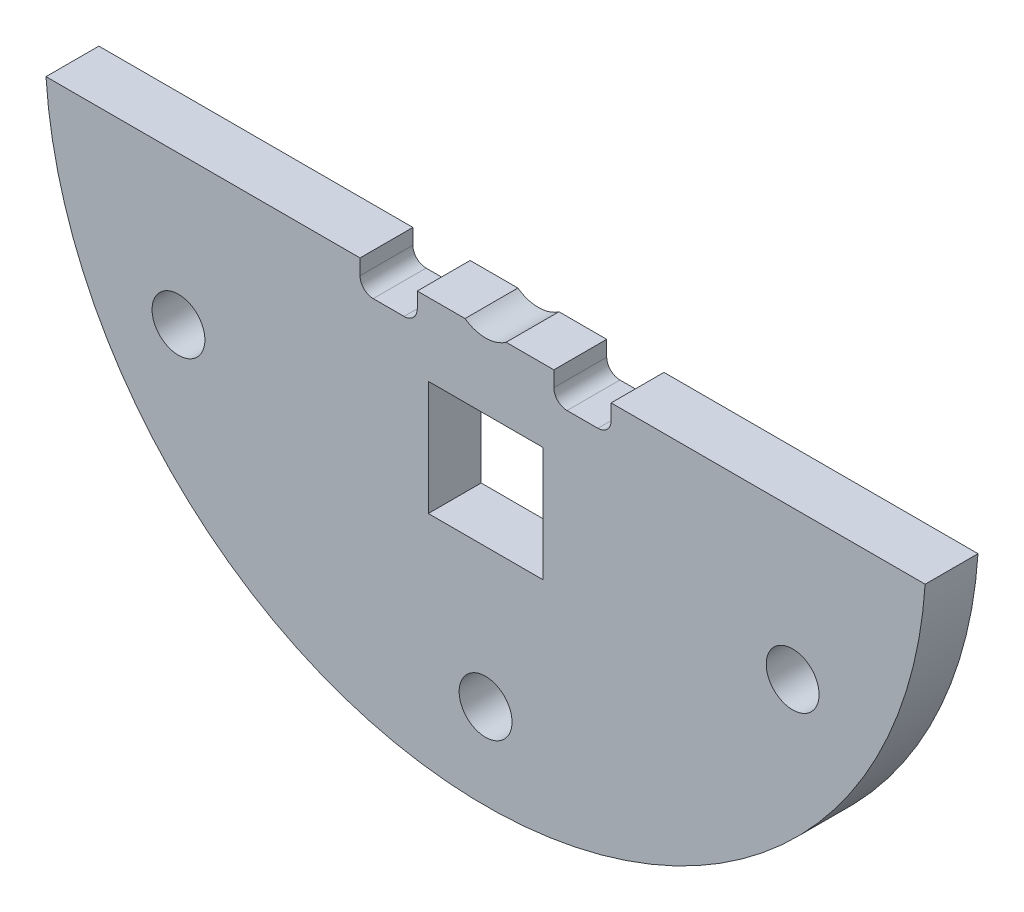
ISO-10303-21;
HEADER;
FILE_DESCRIPTION(('STEP AP214'),'2;1');
FILE_NAME('part.step','',(''),(''),'','','');
FILE_SCHEMA(('AUTOMOTIVE_DESIGN { 1 0 10303 214 1 1 1 1 }'));
ENDSEC;
DATA;
#1=APPLICATION_CONTEXT('core data for automotive mechanical design processes');
#2=APPLICATION_PROTOCOL_DEFINITION('international standard','automotive_design',2000,#1);
#3=PRODUCT_CONTEXT('',#1,'mechanical');
#4=PRODUCT('Part','Part','',(#3));
#5=PRODUCT_RELATED_PRODUCT_CATEGORY('part','',(#4));
#6=PRODUCT_DEFINITION_FORMATION('','',#4);
#7=PRODUCT_DEFINITION_CONTEXT('part definition',#1,'design');
#8=PRODUCT_DEFINITION('design','',#6,#7);
#9=PRODUCT_DEFINITION_SHAPE('','',#8);
#10=(LENGTH_UNIT() NAMED_UNIT(*) SI_UNIT(.MILLI.,.METRE.));
#11=(NAMED_UNIT(*) PLANE_ANGLE_UNIT() SI_UNIT($,.RADIAN.));
#12=(NAMED_UNIT(*) SI_UNIT($,.STERADIAN.) SOLID_ANGLE_UNIT());
#13=UNCERTAINTY_MEASURE_WITH_UNIT(LENGTH_MEASURE(1.E-05),#10,'distance_accuracy_value','');
#14=(GEOMETRIC_REPRESENTATION_CONTEXT(3) GLOBAL_UNCERTAINTY_ASSIGNED_CONTEXT((#13)) GLOBAL_UNIT_ASSIGNED_CONTEXT((#10,
#11,#12)) REPRESENTATION_CONTEXT('',''));
#15=CARTESIAN_POINT('',(0.,0.,0.));
#16=DIRECTION('',(0.,0.,1.));
#17=DIRECTION('',(1.,0.,0.));
#18=AXIS2_PLACEMENT_3D('',#15,#16,#17);
#19=CARTESIAN_POINT('',(190.230949351342,190.589281636706,3.));
#20=DIRECTION('',(0.,0.,1.));
#21=DIRECTION('',(1.,0.,0.));
#22=AXIS2_PLACEMENT_3D('',#19,#20,#21);
#23=PLANE('',#22);
#24=CARTESIAN_POINT('',(207.6593744092,180.5269757379,3.));
#25=DIRECTION('',(0.,0.,1.));
#26=DIRECTION('',(1.,0.,0.));
#27=AXIS2_PLACEMENT_3D('',#24,#25,#26);
#28=CIRCLE('',#27,1.5);
#29=CARTESIAN_POINT('',(209.1593744092,180.5269757379,3.));
#30=VERTEX_POINT('',#29);
#31=EDGE_CURVE('E206',#30,#30,#28,.T.);
#32=ORIENTED_EDGE('',*,*,#31,.F.);
#33=EDGE_LOOP('',(#32));
#34=FACE_BOUND('',#33,.T.);
#35=CARTESIAN_POINT('',(172.8025242934,180.5269757379,3.));
#36=DIRECTION('',(0.,0.,1.));
#37=DIRECTION('',(1.,0.,0.));
#38=AXIS2_PLACEMENT_3D('',#35,#36,#37);
#39=CIRCLE('',#38,1.5);
#40=CARTESIAN_POINT('',(174.3025242934,180.5269757379,3.));
#41=VERTEX_POINT('',#40);
#42=EDGE_CURVE('E218',#41,#41,#39,.T.);
#43=ORIENTED_EDGE('',*,*,#42,.F.);
#44=EDGE_LOOP('',(#43));
#45=FACE_BOUND('',#44,.T.);
#46=CARTESIAN_POINT('',(190.230949351342,190.589281636706,3.));
#47=DIRECTION('',(0.,0.,1.));
#48=DIRECTION('',(1.,0.,0.));
#49=AXIS2_PLACEMENT_3D('',#46,#47,#48);
#50=CIRCLE('',#49,25.);
#51=CARTESIAN_POINT('',(165.2838177527,188.9642816367,3.));
#52=VERTEX_POINT('',#51);
#53=CARTESIAN_POINT('',(215.1780809499,188.9642816367,3.));
#54=VERTEX_POINT('',#53);
#55=EDGE_CURVE('E224',#52,#54,#50,.T.);
#56=ORIENTED_EDGE('',*,*,#55,.T.);
#57=DIRECTION('',(-1.,0.,0.));
#58=VECTOR('',#57,1.);
#59=CARTESIAN_POINT('',(197.3559493513,188.9642816367,3.));
#60=LINE('',#59,#58);
#61=CARTESIAN_POINT('',(197.3559493513,188.9642816367,3.));
#62=VERTEX_POINT('',#61);
#63=EDGE_CURVE('E226',#54,#62,#60,.T.);
#64=ORIENTED_EDGE('',*,*,#63,.T.);
#65=DIRECTION('',(0.,-1.,0.));
#66=VECTOR('',#65,1.);
#67=CARTESIAN_POINT('',(197.3559493513,188.0892816367,3.));
#68=LINE('',#67,#66);
#69=CARTESIAN_POINT('',(197.3559493513,188.0892816367,3.));
#70=VERTEX_POINT('',#69);
#71=EDGE_CURVE('E229',#62,#70,#68,.T.);
#72=ORIENTED_EDGE('',*,*,#71,.T.);
#73=CARTESIAN_POINT('',(196.6059493513,188.0892816367,3.));
#74=DIRECTION('',(0.,0.,-1.));
#75=DIRECTION('',(1.,0.,0.));
#76=AXIS2_PLACEMENT_3D('',#73,#74,#75);
#77=CIRCLE('',#76,0.750000000000237);
#78=CARTESIAN_POINT('',(196.6059493513,187.3392816367,3.));
#79=VERTEX_POINT('',#78);
#80=EDGE_CURVE('E231',#70,#79,#77,.T.);
#81=ORIENTED_EDGE('',*,*,#80,.T.);
#82=DIRECTION('',(-1.,0.,0.));
#83=VECTOR('',#82,1.);
#84=CARTESIAN_POINT('',(194.8559493513,187.3392816367,3.));
#85=LINE('',#84,#83);
#86=CARTESIAN_POINT('',(194.8559493513,187.3392816367,3.));
#87=VERTEX_POINT('',#86);
#88=EDGE_CURVE('E233',#79,#87,#85,.T.);
#89=ORIENTED_EDGE('',*,*,#88,.T.);
#90=CARTESIAN_POINT('',(194.8559493513,188.0892816367,3.));
#91=DIRECTION('',(0.,0.,-1.));
#92=DIRECTION('',(1.,0.,0.));
#93=AXIS2_PLACEMENT_3D('',#90,#91,#92);
#94=CIRCLE('',#93,0.750000000000001);
#95=CARTESIAN_POINT('',(194.1059493513,188.0892816367,3.));
#96=VERTEX_POINT('',#95);
#97=EDGE_CURVE('E235',#87,#96,#94,.T.);
#98=ORIENTED_EDGE('',*,*,#97,.T.);
#99=DIRECTION('',(0.,1.,0.));
#100=VECTOR('',#99,1.);
#101=CARTESIAN_POINT('',(194.1059493513,188.9642816367,3.));
#102=LINE('',#101,#100);
#103=CARTESIAN_POINT('',(194.1059493513,188.9642816367,3.));
#104=VERTEX_POINT('',#103);
#105=EDGE_CURVE('E237',#96,#104,#102,.T.);
#106=ORIENTED_EDGE('',*,*,#105,.T.);
#107=DIRECTION('',(-1.,-2.97116512054396E-13,0.));
#108=VECTOR('',#107,1.);
#109=CARTESIAN_POINT('',(191.396871732935,188.964281636699,3.));
#110=LINE('',#109,#108);
#111=CARTESIAN_POINT('',(191.396871732949,188.964281636679,3.));
#112=VERTEX_POINT('',#111);
#113=EDGE_CURVE('E239',#104,#112,#110,.T.);
#114=ORIENTED_EDGE('',*,*,#113,.T.);
#115=CARTESIAN_POINT('',(190.230949351342,190.589281636706,3.));
#116=DIRECTION('',(0.,0.,-1.));
#117=DIRECTION('',(1.,0.,0.));
#118=AXIS2_PLACEMENT_3D('',#115,#116,#117);
#119=CIRCLE('',#118,2.00000000000458);
#120=CARTESIAN_POINT('',(189.065026969665,188.964281636699,3.));
#121=VERTEX_POINT('',#120);
#122=EDGE_CURVE('E241',#112,#121,#119,.T.);
#123=ORIENTED_EDGE('',*,*,#122,.T.);
#124=DIRECTION('',(-1.,2.97116512054396E-13,0.));
#125=VECTOR('',#124,1.);
#126=CARTESIAN_POINT('',(186.3559493513,188.9642816367,3.));
#127=LINE('',#126,#125);
#128=CARTESIAN_POINT('',(186.3559493513,188.9642816367,3.));
#129=VERTEX_POINT('',#128);
#130=EDGE_CURVE('E243',#121,#129,#127,.T.);
#131=ORIENTED_EDGE('',*,*,#130,.T.);
#132=DIRECTION('',(0.,-1.,0.));
#133=VECTOR('',#132,1.);
#134=CARTESIAN_POINT('',(186.3559493513,188.9642816367,3.));
#135=LINE('',#134,#133);
#136=CARTESIAN_POINT('',(186.3559493513,188.0892816367,3.));
#137=VERTEX_POINT('',#136);
#138=EDGE_CURVE('E245',#129,#137,#135,.T.);
#139=ORIENTED_EDGE('',*,*,#138,.T.);
#140=CARTESIAN_POINT('',(185.6059493513,188.0892816367,3.));
#141=DIRECTION('',(0.,0.,-1.));
#142=DIRECTION('',(1.,0.,0.));
#143=AXIS2_PLACEMENT_3D('',#140,#141,#142);
#144=CIRCLE('',#143,0.750000000000001);
#145=CARTESIAN_POINT('',(185.6059493513,187.3392816367,3.));
#146=VERTEX_POINT('',#145);
#147=EDGE_CURVE('E247',#137,#146,#144,.T.);
#148=ORIENTED_EDGE('',*,*,#147,.T.);
#149=DIRECTION('',(-1.,0.,0.));
#150=VECTOR('',#149,1.);
#151=CARTESIAN_POINT('',(185.6059493513,187.3392816367,3.));
#152=LINE('',#151,#150);
#153=CARTESIAN_POINT('',(183.8559493513,187.3392816367,3.));
#154=VERTEX_POINT('',#153);
#155=EDGE_CURVE('E249',#146,#154,#152,.T.);
#156=ORIENTED_EDGE('',*,*,#155,.T.);
#157=CARTESIAN_POINT('',(183.8559493513,188.0892816367,3.));
#158=DIRECTION('',(0.,0.,-1.));
#159=DIRECTION('',(1.,0.,0.));
#160=AXIS2_PLACEMENT_3D('',#157,#158,#159);
#161=CIRCLE('',#160,0.750000000000001);
#162=CARTESIAN_POINT('',(183.1059493513,188.0892816367,3.));
#163=VERTEX_POINT('',#162);
#164=EDGE_CURVE('E251',#154,#163,#161,.T.);
#165=ORIENTED_EDGE('',*,*,#164,.T.);
#166=DIRECTION('',(0.,1.,0.));
#167=VECTOR('',#166,1.);
#168=CARTESIAN_POINT('',(183.1059493513,188.0892816367,3.));
#169=LINE('',#168,#167);
#170=CARTESIAN_POINT('',(183.1059493513,188.9642816367,3.));
#171=VERTEX_POINT('',#170);
#172=EDGE_CURVE('E253',#163,#171,#169,.T.);
#173=ORIENTED_EDGE('',*,*,#172,.T.);
#174=DIRECTION('',(-1.,0.,0.));
#175=VECTOR('',#174,1.);
#176=CARTESIAN_POINT('',(165.2838177527,188.9642816367,3.));
#177=LINE('',#176,#175);
#178=EDGE_CURVE('E255',#171,#52,#177,.T.);
#179=ORIENTED_EDGE('',*,*,#178,.T.);
#180=EDGE_LOOP('',(#56,#64,#72,#81,#89,#98,#106,#114,#123,#131,#139,#148,#156,#165,#173,#179));
#181=FACE_BOUND('',#180,.T.);
#182=CARTESIAN_POINT('',(190.2309493513,170.4646698392,3.));
#183=DIRECTION('',(0.,0.,1.));
#184=DIRECTION('',(1.,0.,0.));
#185=AXIS2_PLACEMENT_3D('',#182,#183,#184);
#186=CIRCLE('',#185,1.5);
#187=CARTESIAN_POINT('',(191.7309493513,170.4646698392,3.));
#188=VERTEX_POINT('',#187);
#189=EDGE_CURVE('E212',#188,#188,#186,.T.);
#190=ORIENTED_EDGE('',*,*,#189,.F.);
#191=EDGE_LOOP('',(#190));
#192=FACE_BOUND('',#191,.T.);
#193=DIRECTION('',(-1.,0.,0.));
#194=VECTOR('',#193,1.);
#195=CARTESIAN_POINT('',(193.4809493513,184.8392816367,3.));
#196=LINE('',#195,#194);
#197=CARTESIAN_POINT('',(193.4809493513,184.8392816367,3.));
#198=VERTEX_POINT('',#197);
#199=CARTESIAN_POINT('',(186.9809493513,184.8392816367,3.));
#200=VERTEX_POINT('',#199);
#201=EDGE_CURVE('E178',#198,#200,#196,.T.);
#202=ORIENTED_EDGE('',*,*,#201,.F.);
#203=DIRECTION('',(0.,1.,0.));
#204=VECTOR('',#203,1.);
#205=CARTESIAN_POINT('',(193.4809493513,178.3392816367,3.));
#206=LINE('',#205,#204);
#207=CARTESIAN_POINT('',(193.4809493513,178.3392816367,3.));
#208=VERTEX_POINT('',#207);
#209=EDGE_CURVE('E170',#208,#198,#206,.T.);
#210=ORIENTED_EDGE('',*,*,#209,.F.);
#211=DIRECTION('',(1.,0.,0.));
#212=VECTOR('',#211,1.);
#213=CARTESIAN_POINT('',(186.9809493513,178.3392816367,3.));
#214=LINE('',#213,#212);
#215=CARTESIAN_POINT('',(186.9809493513,178.3392816367,3.));
#216=VERTEX_POINT('',#215);
#217=EDGE_CURVE('E192',#216,#208,#214,.T.);
#218=ORIENTED_EDGE('',*,*,#217,.F.);
#219=DIRECTION('',(0.,-1.,0.));
#220=VECTOR('',#219,1.);
#221=CARTESIAN_POINT('',(186.9809493513,184.8392816367,3.));
#222=LINE('',#221,#220);
#223=EDGE_CURVE('E190',#200,#216,#222,.T.);
#224=ORIENTED_EDGE('',*,*,#223,.F.);
#225=EDGE_LOOP('',(#202,#210,#218,#224));
#226=FACE_BOUND('',#225,.T.);
#227=ADVANCED_FACE('F33',(#34,#45,#181,#192,#226),#23,.T.);
#228=CARTESIAN_POINT('',(190.230949351342,190.589281636706,0.));
#229=DIRECTION('',(0.,0.,1.));
#230=DIRECTION('',(1.,0.,0.));
#231=AXIS2_PLACEMENT_3D('',#228,#229,#230);
#232=PLANE('',#231);
#233=CARTESIAN_POINT('',(207.6593744092,180.5269757379,0.));
#234=DIRECTION('',(0.,0.,1.));
#235=DIRECTION('',(1.,0.,0.));
#236=AXIS2_PLACEMENT_3D('',#233,#234,#235);
#237=CIRCLE('',#236,1.5);
#238=CARTESIAN_POINT('',(209.1593744092,180.5269757379,0.));
#239=VERTEX_POINT('',#238);
#240=EDGE_CURVE('E186',#239,#239,#237,.T.);
#241=ORIENTED_EDGE('',*,*,#240,.T.);
#242=EDGE_LOOP('',(#241));
#243=FACE_BOUND('',#242,.T.);
#244=CARTESIAN_POINT('',(172.8025242934,180.5269757379,0.));
#245=DIRECTION('',(0.,0.,1.));
#246=DIRECTION('',(1.,0.,0.));
#247=AXIS2_PLACEMENT_3D('',#244,#245,#246);
#248=CIRCLE('',#247,1.5);
#249=CARTESIAN_POINT('',(174.3025242934,180.5269757379,0.));
#250=VERTEX_POINT('',#249);
#251=EDGE_CURVE('E215',#250,#250,#248,.T.);
#252=ORIENTED_EDGE('',*,*,#251,.T.);
#253=EDGE_LOOP('',(#252));
#254=FACE_BOUND('',#253,.T.);
#255=CARTESIAN_POINT('',(190.230949351342,190.589281636706,0.));
#256=DIRECTION('',(0.,0.,1.));
#257=DIRECTION('',(1.,0.,0.));
#258=AXIS2_PLACEMENT_3D('',#255,#256,#257);
#259=CIRCLE('',#258,24.9999999999577);
#260=CARTESIAN_POINT('',(165.2838177527,188.9642816367,0.));
#261=VERTEX_POINT('',#260);
#262=CARTESIAN_POINT('',(215.1780809499,188.9642816367,0.));
#263=VERTEX_POINT('',#262);
#264=EDGE_CURVE('E221',#261,#263,#259,.T.);
#265=ORIENTED_EDGE('',*,*,#264,.F.);
#266=DIRECTION('',(-1.,0.,0.));
#267=VECTOR('',#266,1.);
#268=CARTESIAN_POINT('',(165.2838177527,188.9642816367,0.));
#269=LINE('',#268,#267);
#270=CARTESIAN_POINT('',(183.1059493513,188.9642816367,0.));
#271=VERTEX_POINT('',#270);
#272=EDGE_CURVE('E227',#271,#261,#269,.T.);
#273=ORIENTED_EDGE('',*,*,#272,.F.);
#274=DIRECTION('',(0.,1.,0.));
#275=VECTOR('',#274,1.);
#276=CARTESIAN_POINT('',(183.1059493513,188.0892816367,0.));
#277=LINE('',#276,#275);
#278=CARTESIAN_POINT('',(183.1059493513,188.0892816367,0.));
#279=VERTEX_POINT('',#278);
#280=EDGE_CURVE('E285',#279,#271,#277,.T.);
#281=ORIENTED_EDGE('',*,*,#280,.F.);
#282=CARTESIAN_POINT('',(183.8559493513,188.0892816367,0.));
#283=DIRECTION('',(0.,0.,-1.));
#284=DIRECTION('',(1.,0.,0.));
#285=AXIS2_PLACEMENT_3D('',#282,#283,#284);
#286=CIRCLE('',#285,0.750000000000001);
#287=CARTESIAN_POINT('',(183.8559493513,187.3392816367,0.));
#288=VERTEX_POINT('',#287);
#289=EDGE_CURVE('E283',#288,#279,#286,.T.);
#290=ORIENTED_EDGE('',*,*,#289,.F.);
#291=DIRECTION('',(-1.,0.,0.));
#292=VECTOR('',#291,1.);
#293=CARTESIAN_POINT('',(185.6059493513,187.3392816367,0.));
#294=LINE('',#293,#292);
#295=CARTESIAN_POINT('',(185.6059493513,187.3392816367,0.));
#296=VERTEX_POINT('',#295);
#297=EDGE_CURVE('E281',#296,#288,#294,.T.);
#298=ORIENTED_EDGE('',*,*,#297,.F.);
#299=CARTESIAN_POINT('',(185.6059493513,188.0892816367,0.));
#300=DIRECTION('',(0.,0.,-1.));
#301=DIRECTION('',(1.,0.,0.));
#302=AXIS2_PLACEMENT_3D('',#299,#300,#301);
#303=CIRCLE('',#302,0.750000000000001);
#304=CARTESIAN_POINT('',(186.3559493513,188.0892816367,0.));
#305=VERTEX_POINT('',#304);
#306=EDGE_CURVE('E279',#305,#296,#303,.T.);
#307=ORIENTED_EDGE('',*,*,#306,.F.);
#308=DIRECTION('',(0.,-1.,0.));
#309=VECTOR('',#308,1.);
#310=CARTESIAN_POINT('',(186.3559493513,188.9642816367,0.));
#311=LINE('',#310,#309);
#312=CARTESIAN_POINT('',(186.3559493513,188.9642816367,0.));
#313=VERTEX_POINT('',#312);
#314=EDGE_CURVE('E277',#313,#305,#311,.T.);
#315=ORIENTED_EDGE('',*,*,#314,.F.);
#316=DIRECTION('',(-1.,2.97116512054396E-13,0.));
#317=VECTOR('',#316,1.);
#318=CARTESIAN_POINT('',(186.3559493513,188.9642816367,0.));
#319=LINE('',#318,#317);
#320=CARTESIAN_POINT('',(189.065026969665,188.964281636699,0.));
#321=VERTEX_POINT('',#320);
#322=EDGE_CURVE('E275',#321,#313,#319,.T.);
#323=ORIENTED_EDGE('',*,*,#322,.F.);
#324=CARTESIAN_POINT('',(190.230949351342,190.589281636706,0.));
#325=DIRECTION('',(0.,0.,-1.));
#326=DIRECTION('',(1.,0.,0.));
#327=AXIS2_PLACEMENT_3D('',#324,#325,#326);
#328=CIRCLE('',#327,2.00000000000458);
#329=CARTESIAN_POINT('',(191.396871732949,188.964281636679,0.));
#330=VERTEX_POINT('',#329);
#331=EDGE_CURVE('E273',#330,#321,#328,.T.);
#332=ORIENTED_EDGE('',*,*,#331,.F.);
#333=DIRECTION('',(-1.,-2.97116512054396E-13,0.));
#334=VECTOR('',#333,1.);
#335=CARTESIAN_POINT('',(191.396871732935,188.964281636699,0.));
#336=LINE('',#335,#334);
#337=CARTESIAN_POINT('',(194.1059493513,188.9642816367,0.));
#338=VERTEX_POINT('',#337);
#339=EDGE_CURVE('E271',#338,#330,#336,.T.);
#340=ORIENTED_EDGE('',*,*,#339,.F.);
#341=DIRECTION('',(0.,1.,0.));
#342=VECTOR('',#341,1.);
#343=CARTESIAN_POINT('',(194.1059493513,188.9642816367,0.));
#344=LINE('',#343,#342);
#345=CARTESIAN_POINT('',(194.1059493513,188.0892816367,0.));
#346=VERTEX_POINT('',#345);
#347=EDGE_CURVE('E269',#346,#338,#344,.T.);
#348=ORIENTED_EDGE('',*,*,#347,.F.);
#349=CARTESIAN_POINT('',(194.8559493513,188.0892816367,0.));
#350=DIRECTION('',(0.,0.,-1.));
#351=DIRECTION('',(1.,0.,0.));
#352=AXIS2_PLACEMENT_3D('',#349,#350,#351);
#353=CIRCLE('',#352,0.750000000000001);
#354=CARTESIAN_POINT('',(194.8559493513,187.3392816367,0.));
#355=VERTEX_POINT('',#354);
#356=EDGE_CURVE('E267',#355,#346,#353,.T.);
#357=ORIENTED_EDGE('',*,*,#356,.F.);
#358=DIRECTION('',(-1.,0.,0.));
#359=VECTOR('',#358,1.);
#360=CARTESIAN_POINT('',(194.8559493513,187.3392816367,0.));
#361=LINE('',#360,#359);
#362=CARTESIAN_POINT('',(196.6059493513,187.3392816367,0.));
#363=VERTEX_POINT('',#362);
#364=EDGE_CURVE('E265',#363,#355,#361,.T.);
#365=ORIENTED_EDGE('',*,*,#364,.F.);
#366=CARTESIAN_POINT('',(196.6059493513,188.0892816367,0.));
#367=DIRECTION('',(0.,0.,-1.));
#368=DIRECTION('',(1.,0.,0.));
#369=AXIS2_PLACEMENT_3D('',#366,#367,#368);
#370=CIRCLE('',#369,0.750000000000237);
#371=CARTESIAN_POINT('',(197.3559493513,188.0892816367,0.));
#372=VERTEX_POINT('',#371);
#373=EDGE_CURVE('E263',#372,#363,#370,.T.);
#374=ORIENTED_EDGE('',*,*,#373,.F.);
#375=DIRECTION('',(0.,-1.,0.));
#376=VECTOR('',#375,1.);
#377=CARTESIAN_POINT('',(197.3559493513,188.0892816367,0.));
#378=LINE('',#377,#376);
#379=CARTESIAN_POINT('',(197.3559493513,188.9642816367,0.));
#380=VERTEX_POINT('',#379);
#381=EDGE_CURVE('E261',#380,#372,#378,.T.);
#382=ORIENTED_EDGE('',*,*,#381,.F.);
#383=DIRECTION('',(-1.,0.,0.));
#384=VECTOR('',#383,1.);
#385=CARTESIAN_POINT('',(197.3559493513,188.9642816367,0.));
#386=LINE('',#385,#384);
#387=EDGE_CURVE('E259',#263,#380,#386,.T.);
#388=ORIENTED_EDGE('',*,*,#387,.F.);
#389=EDGE_LOOP('',(#265,#273,#281,#290,#298,#307,#315,#323,#332,#340,#348,#357,#365,#374,#382,#388));
#390=FACE_BOUND('',#389,.T.);
#391=CARTESIAN_POINT('',(190.2309493513,170.4646698392,0.));
#392=DIRECTION('',(0.,0.,1.));
#393=DIRECTION('',(1.,0.,0.));
#394=AXIS2_PLACEMENT_3D('',#391,#392,#393);
#395=CIRCLE('',#394,1.5);
#396=CARTESIAN_POINT('',(191.7309493513,170.4646698392,0.));
#397=VERTEX_POINT('',#396);
#398=EDGE_CURVE('E209',#397,#397,#395,.T.);
#399=ORIENTED_EDGE('',*,*,#398,.T.);
#400=EDGE_LOOP('',(#399));
#401=FACE_BOUND('',#400,.T.);
#402=DIRECTION('',(0.,1.,0.));
#403=VECTOR('',#402,1.);
#404=CARTESIAN_POINT('',(193.4809493513,178.3392816367,0.));
#405=LINE('',#404,#403);
#406=CARTESIAN_POINT('',(193.4809493513,178.3392816367,0.));
#407=VERTEX_POINT('',#406);
#408=CARTESIAN_POINT('',(193.4809493513,184.8392816367,0.));
#409=VERTEX_POINT('',#408);
#410=EDGE_CURVE('E56',#407,#409,#405,.T.);
#411=ORIENTED_EDGE('',*,*,#410,.T.);
#412=DIRECTION('',(-1.,0.,0.));
#413=VECTOR('',#412,1.);
#414=CARTESIAN_POINT('',(193.4809493513,184.8392816367,0.));
#415=LINE('',#414,#413);
#416=CARTESIAN_POINT('',(186.9809493513,184.8392816367,0.));
#417=VERTEX_POINT('',#416);
#418=EDGE_CURVE('E185',#409,#417,#415,.T.);
#419=ORIENTED_EDGE('',*,*,#418,.T.);
#420=DIRECTION('',(0.,-1.,0.));
#421=VECTOR('',#420,1.);
#422=CARTESIAN_POINT('',(186.9809493513,184.8392816367,0.));
#423=LINE('',#422,#421);
#424=CARTESIAN_POINT('',(186.9809493513,178.3392816367,0.));
#425=VERTEX_POINT('',#424);
#426=EDGE_CURVE('E198',#417,#425,#423,.T.);
#427=ORIENTED_EDGE('',*,*,#426,.T.);
#428=DIRECTION('',(1.,0.,0.));
#429=VECTOR('',#428,1.);
#430=CARTESIAN_POINT('',(186.9809493513,178.3392816367,0.));
#431=LINE('',#430,#429);
#432=EDGE_CURVE('E179',#425,#407,#431,.T.);
#433=ORIENTED_EDGE('',*,*,#432,.T.);
#434=EDGE_LOOP('',(#411,#419,#427,#433));
#435=FACE_BOUND('',#434,.T.);
#436=ADVANCED_FACE('F341',(#243,#254,#390,#401,#435),#232,.F.);
#437=CARTESIAN_POINT('',(190.230949351342,190.589281636706,3.));
#438=DIRECTION('',(0.,0.,-1.));
#439=DIRECTION('',(-1.,0.,0.));
#440=AXIS2_PLACEMENT_3D('',#437,#438,#439);
#441=CYLINDRICAL_SURFACE('',#440,24.9999999999577);
#442=ORIENTED_EDGE('',*,*,#264,.T.);
#443=DIRECTION('',(0.,0.,-1.));
#444=VECTOR('',#443,1.);
#445=CARTESIAN_POINT('',(215.1780809499,188.9642816367,3.));
#446=LINE('',#445,#444);
#447=EDGE_CURVE('E11',#54,#263,#446,.T.);
#448=ORIENTED_EDGE('',*,*,#447,.F.);
#449=ORIENTED_EDGE('',*,*,#55,.F.);
#450=DIRECTION('',(0.,0.,-1.));
#451=VECTOR('',#450,1.);
#452=CARTESIAN_POINT('',(165.2838177527,188.9642816367,3.));
#453=LINE('',#452,#451);
#454=EDGE_CURVE('E257',#52,#261,#453,.T.);
#455=ORIENTED_EDGE('',*,*,#454,.T.);
#456=EDGE_LOOP('',(#442,#448,#449,#455));
#457=FACE_BOUND('',#456,.T.);
#458=ADVANCED_FACE('F35',(#457),#441,.T.);
#459=CARTESIAN_POINT('',(197.3559493513,188.9642816367,3.));
#460=DIRECTION('',(0.,-1.,0.));
#461=DIRECTION('',(0.,0.,-1.));
#462=AXIS2_PLACEMENT_3D('',#459,#460,#461);
#463=PLANE('',#462);
#464=ORIENTED_EDGE('',*,*,#387,.T.);
#465=DIRECTION('',(0.,0.,-1.));
#466=VECTOR('',#465,1.);
#467=CARTESIAN_POINT('',(197.3559493513,188.9642816367,3.));
#468=LINE('',#467,#466);
#469=EDGE_CURVE('E41',#62,#380,#468,.T.);
#470=ORIENTED_EDGE('',*,*,#469,.F.);
#471=ORIENTED_EDGE('',*,*,#63,.F.);
#472=ORIENTED_EDGE('',*,*,#447,.T.);
#473=EDGE_LOOP('',(#464,#470,#471,#472));
#474=FACE_BOUND('',#473,.T.);
#475=ADVANCED_FACE('F359',(#474),#463,.F.);
#476=CARTESIAN_POINT('',(197.3559493513,188.0892816367,3.));
#477=DIRECTION('',(1.,0.,0.));
#478=DIRECTION('',(0.,0.,-1.));
#479=AXIS2_PLACEMENT_3D('',#476,#477,#478);
#480=PLANE('',#479);
#481=ORIENTED_EDGE('',*,*,#381,.T.);
#482=DIRECTION('',(0.,0.,-1.));
#483=VECTOR('',#482,1.);
#484=CARTESIAN_POINT('',(197.3559493513,188.0892816367,3.));
#485=LINE('',#484,#483);
#486=EDGE_CURVE('E327',#70,#372,#485,.T.);
#487=ORIENTED_EDGE('',*,*,#486,.F.);
#488=ORIENTED_EDGE('',*,*,#71,.F.);
#489=ORIENTED_EDGE('',*,*,#469,.T.);
#490=EDGE_LOOP('',(#481,#487,#488,#489));
#491=FACE_BOUND('',#490,.T.);
#492=ADVANCED_FACE('F334',(#491),#480,.F.);
#493=CARTESIAN_POINT('',(196.6059493513,188.0892816367,3.));
#494=DIRECTION('',(0.,0.,-1.));
#495=DIRECTION('',(-1.,0.,0.));
#496=AXIS2_PLACEMENT_3D('',#493,#494,#495);
#497=CYLINDRICAL_SURFACE('',#496,0.750000000000237);
#498=ORIENTED_EDGE('',*,*,#373,.T.);
#499=DIRECTION('',(0.,0.,-1.));
#500=VECTOR('',#499,1.);
#501=CARTESIAN_POINT('',(196.6059493513,187.3392816367,3.));
#502=LINE('',#501,#500);
#503=EDGE_CURVE('E324',#79,#363,#502,.T.);
#504=ORIENTED_EDGE('',*,*,#503,.F.);
#505=ORIENTED_EDGE('',*,*,#80,.F.);
#506=ORIENTED_EDGE('',*,*,#486,.T.);
#507=EDGE_LOOP('',(#498,#504,#505,#506));
#508=FACE_BOUND('',#507,.T.);
#509=ADVANCED_FACE('F347',(#508),#497,.F.);
#510=CARTESIAN_POINT('',(194.8559493513,187.3392816367,3.));
#511=DIRECTION('',(0.,-1.,0.));
#512=DIRECTION('',(0.,0.,-1.));
#513=AXIS2_PLACEMENT_3D('',#510,#511,#512);
#514=PLANE('',#513);
#515=ORIENTED_EDGE('',*,*,#364,.T.);
#516=DIRECTION('',(0.,0.,-1.));
#517=VECTOR('',#516,1.);
#518=CARTESIAN_POINT('',(194.8559493513,187.3392816367,3.));
#519=LINE('',#518,#517);
#520=EDGE_CURVE('E321',#87,#355,#519,.T.);
#521=ORIENTED_EDGE('',*,*,#520,.F.);
#522=ORIENTED_EDGE('',*,*,#88,.F.);
#523=ORIENTED_EDGE('',*,*,#503,.T.);
#524=EDGE_LOOP('',(#515,#521,#522,#523));
#525=FACE_BOUND('',#524,.T.);
#526=ADVANCED_FACE('F351',(#525),#514,.F.);
#527=CARTESIAN_POINT('',(194.8559493513,188.0892816367,3.));
#528=DIRECTION('',(0.,0.,-1.));
#529=DIRECTION('',(-1.,0.,0.));
#530=AXIS2_PLACEMENT_3D('',#527,#528,#529);
#531=CYLINDRICAL_SURFACE('',#530,0.750000000000001);
#532=ORIENTED_EDGE('',*,*,#356,.T.);
#533=DIRECTION('',(0.,0.,-1.));
#534=VECTOR('',#533,1.);
#535=CARTESIAN_POINT('',(194.1059493513,188.0892816367,3.));
#536=LINE('',#535,#534);
#537=EDGE_CURVE('E318',#96,#346,#536,.T.);
#538=ORIENTED_EDGE('',*,*,#537,.F.);
#539=ORIENTED_EDGE('',*,*,#97,.F.);
#540=ORIENTED_EDGE('',*,*,#520,.T.);
#541=EDGE_LOOP('',(#532,#538,#539,#540));
#542=FACE_BOUND('',#541,.T.);
#543=ADVANCED_FACE('F412',(#542),#531,.F.);
#544=CARTESIAN_POINT('',(194.1059493513,188.9642816367,3.));
#545=DIRECTION('',(-1.,0.,0.));
#546=DIRECTION('',(0.,0.,1.));
#547=AXIS2_PLACEMENT_3D('',#544,#545,#546);
#548=PLANE('',#547);
#549=ORIENTED_EDGE('',*,*,#347,.T.);
#550=DIRECTION('',(0.,0.,-1.));
#551=VECTOR('',#550,1.);
#552=CARTESIAN_POINT('',(194.1059493513,188.9642816367,3.));
#553=LINE('',#552,#551);
#554=EDGE_CURVE('E315',#104,#338,#553,.T.);
#555=ORIENTED_EDGE('',*,*,#554,.F.);
#556=ORIENTED_EDGE('',*,*,#105,.F.);
#557=ORIENTED_EDGE('',*,*,#537,.T.);
#558=EDGE_LOOP('',(#549,#555,#556,#557));
#559=FACE_BOUND('',#558,.T.);
#560=ADVANCED_FACE('F410',(#559),#548,.F.);
#561=CARTESIAN_POINT('',(191.396871732935,188.964281636699,3.));
#562=DIRECTION('',(2.97116512054396E-13,-1.,0.));
#563=DIRECTION('',(1.,2.97116512054396E-13,0.));
#564=AXIS2_PLACEMENT_3D('',#561,#562,#563);
#565=PLANE('',#564);
#566=ORIENTED_EDGE('',*,*,#339,.T.);
#567=DIRECTION('',(0.,0.,-1.));
#568=VECTOR('',#567,1.);
#569=CARTESIAN_POINT('',(191.396871732949,188.964281636679,3.));
#570=LINE('',#569,#568);
#571=EDGE_CURVE('E312',#112,#330,#570,.T.);
#572=ORIENTED_EDGE('',*,*,#571,.F.);
#573=ORIENTED_EDGE('',*,*,#113,.F.);
#574=ORIENTED_EDGE('',*,*,#554,.T.);
#575=EDGE_LOOP('',(#566,#572,#573,#574));
#576=FACE_BOUND('',#575,.T.);
#577=ADVANCED_FACE('F405',(#576),#565,.F.);
#578=CARTESIAN_POINT('',(190.230949351342,190.589281636706,3.));
#579=DIRECTION('',(0.,0.,-1.));
#580=DIRECTION('',(-1.,0.,0.));
#581=AXIS2_PLACEMENT_3D('',#578,#579,#580);
#582=CYLINDRICAL_SURFACE('',#581,2.00000000000458);
#583=ORIENTED_EDGE('',*,*,#331,.T.);
#584=DIRECTION('',(0.,0.,-1.));
#585=VECTOR('',#584,1.);
#586=CARTESIAN_POINT('',(189.065026969665,188.964281636699,3.));
#587=LINE('',#586,#585);
#588=EDGE_CURVE('E309',#121,#321,#587,.T.);
#589=ORIENTED_EDGE('',*,*,#588,.F.);
#590=ORIENTED_EDGE('',*,*,#122,.F.);
#591=ORIENTED_EDGE('',*,*,#571,.T.);
#592=EDGE_LOOP('',(#583,#589,#590,#591));
#593=FACE_BOUND('',#592,.T.);
#594=ADVANCED_FACE('F400',(#593),#582,.F.);
#595=CARTESIAN_POINT('',(186.3559493513,188.9642816367,3.));
#596=DIRECTION('',(-2.97116512054396E-13,-1.,0.));
#597=DIRECTION('',(1.,-2.97116512054396E-13,0.));
#598=AXIS2_PLACEMENT_3D('',#595,#596,#597);
#599=PLANE('',#598);
#600=ORIENTED_EDGE('',*,*,#322,.T.);
#601=DIRECTION('',(0.,0.,-1.));
#602=VECTOR('',#601,1.);
#603=CARTESIAN_POINT('',(186.3559493513,188.9642816367,3.));
#604=LINE('',#603,#602);
#605=EDGE_CURVE('E306',#129,#313,#604,.T.);
#606=ORIENTED_EDGE('',*,*,#605,.F.);
#607=ORIENTED_EDGE('',*,*,#130,.F.);
#608=ORIENTED_EDGE('',*,*,#588,.T.);
#609=EDGE_LOOP('',(#600,#606,#607,#608));
#610=FACE_BOUND('',#609,.T.);
#611=ADVANCED_FACE('F396',(#610),#599,.F.);
#612=CARTESIAN_POINT('',(186.3559493513,188.9642816367,3.));
#613=DIRECTION('',(1.,0.,0.));
#614=DIRECTION('',(0.,0.,-1.));
#615=AXIS2_PLACEMENT_3D('',#612,#613,#614);
#616=PLANE('',#615);
#617=ORIENTED_EDGE('',*,*,#314,.T.);
#618=DIRECTION('',(0.,0.,-1.));
#619=VECTOR('',#618,1.);
#620=CARTESIAN_POINT('',(186.3559493513,188.0892816367,3.));
#621=LINE('',#620,#619);
#622=EDGE_CURVE('E303',#137,#305,#621,.T.);
#623=ORIENTED_EDGE('',*,*,#622,.F.);
#624=ORIENTED_EDGE('',*,*,#138,.F.);
#625=ORIENTED_EDGE('',*,*,#605,.T.);
#626=EDGE_LOOP('',(#617,#623,#624,#625));
#627=FACE_BOUND('',#626,.T.);
#628=ADVANCED_FACE('F391',(#627),#616,.F.);
#629=CARTESIAN_POINT('',(185.6059493513,188.0892816367,3.));
#630=DIRECTION('',(0.,0.,-1.));
#631=DIRECTION('',(-1.,0.,0.));
#632=AXIS2_PLACEMENT_3D('',#629,#630,#631);
#633=CYLINDRICAL_SURFACE('',#632,0.750000000000001);
#634=ORIENTED_EDGE('',*,*,#306,.T.);
#635=DIRECTION('',(0.,0.,-1.));
#636=VECTOR('',#635,1.);
#637=CARTESIAN_POINT('',(185.6059493513,187.3392816367,3.));
#638=LINE('',#637,#636);
#639=EDGE_CURVE('E300',#146,#296,#638,.T.);
#640=ORIENTED_EDGE('',*,*,#639,.F.);
#641=ORIENTED_EDGE('',*,*,#147,.F.);
#642=ORIENTED_EDGE('',*,*,#622,.T.);
#643=EDGE_LOOP('',(#634,#640,#641,#642));
#644=FACE_BOUND('',#643,.T.);
#645=ADVANCED_FACE('F385',(#644),#633,.F.);
#646=CARTESIAN_POINT('',(185.6059493513,187.3392816367,3.));
#647=DIRECTION('',(0.,-1.,0.));
#648=DIRECTION('',(0.,0.,-1.));
#649=AXIS2_PLACEMENT_3D('',#646,#647,#648);
#650=PLANE('',#649);
#651=ORIENTED_EDGE('',*,*,#297,.T.);
#652=DIRECTION('',(0.,0.,-1.));
#653=VECTOR('',#652,1.);
#654=CARTESIAN_POINT('',(183.8559493513,187.3392816367,3.));
#655=LINE('',#654,#653);
#656=EDGE_CURVE('E297',#154,#288,#655,.T.);
#657=ORIENTED_EDGE('',*,*,#656,.F.);
#658=ORIENTED_EDGE('',*,*,#155,.F.);
#659=ORIENTED_EDGE('',*,*,#639,.T.);
#660=EDGE_LOOP('',(#651,#657,#658,#659));
#661=FACE_BOUND('',#660,.T.);
#662=ADVANCED_FACE('F381',(#661),#650,.F.);
#663=CARTESIAN_POINT('',(183.8559493513,188.0892816367,3.));
#664=DIRECTION('',(0.,0.,-1.));
#665=DIRECTION('',(-1.,0.,0.));
#666=AXIS2_PLACEMENT_3D('',#663,#664,#665);
#667=CYLINDRICAL_SURFACE('',#666,0.750000000000001);
#668=ORIENTED_EDGE('',*,*,#289,.T.);
#669=DIRECTION('',(0.,0.,-1.));
#670=VECTOR('',#669,1.);
#671=CARTESIAN_POINT('',(183.1059493513,188.0892816367,3.));
#672=LINE('',#671,#670);
#673=EDGE_CURVE('E294',#163,#279,#672,.T.);
#674=ORIENTED_EDGE('',*,*,#673,.F.);
#675=ORIENTED_EDGE('',*,*,#164,.F.);
#676=ORIENTED_EDGE('',*,*,#656,.T.);
#677=EDGE_LOOP('',(#668,#674,#675,#676));
#678=FACE_BOUND('',#677,.T.);
#679=ADVANCED_FACE('F376',(#678),#667,.F.);
#680=CARTESIAN_POINT('',(183.1059493513,188.0892816367,3.));
#681=DIRECTION('',(-1.,0.,0.));
#682=DIRECTION('',(0.,0.,1.));
#683=AXIS2_PLACEMENT_3D('',#680,#681,#682);
#684=PLANE('',#683);
#685=ORIENTED_EDGE('',*,*,#280,.T.);
#686=DIRECTION('',(0.,0.,-1.));
#687=VECTOR('',#686,1.);
#688=CARTESIAN_POINT('',(183.1059493513,188.9642816367,3.));
#689=LINE('',#688,#687);
#690=EDGE_CURVE('E291',#171,#271,#689,.T.);
#691=ORIENTED_EDGE('',*,*,#690,.F.);
#692=ORIENTED_EDGE('',*,*,#172,.F.);
#693=ORIENTED_EDGE('',*,*,#673,.T.);
#694=EDGE_LOOP('',(#685,#691,#692,#693));
#695=FACE_BOUND('',#694,.T.);
#696=ADVANCED_FACE('F370',(#695),#684,.F.);
#697=CARTESIAN_POINT('',(165.2838177527,188.9642816367,3.));
#698=DIRECTION('',(0.,-1.,0.));
#699=DIRECTION('',(0.,0.,-1.));
#700=AXIS2_PLACEMENT_3D('',#697,#698,#699);
#701=PLANE('',#700);
#702=ORIENTED_EDGE('',*,*,#272,.T.);
#703=ORIENTED_EDGE('',*,*,#454,.F.);
#704=ORIENTED_EDGE('',*,*,#178,.F.);
#705=ORIENTED_EDGE('',*,*,#690,.T.);
#706=EDGE_LOOP('',(#702,#703,#704,#705));
#707=FACE_BOUND('',#706,.T.);
#708=ADVANCED_FACE('F365',(#707),#701,.F.);
#709=CARTESIAN_POINT('',(172.8025242934,180.5269757379,3.));
#710=DIRECTION('',(0.,0.,-1.));
#711=DIRECTION('',(-1.,0.,0.));
#712=AXIS2_PLACEMENT_3D('',#709,#710,#711);
#713=CYLINDRICAL_SURFACE('',#712,1.5);
#714=ORIENTED_EDGE('',*,*,#42,.T.);
#715=EDGE_LOOP('',(#714));
#716=FACE_BOUND('',#715,.T.);
#717=ORIENTED_EDGE('',*,*,#251,.F.);
#718=EDGE_LOOP('',(#717));
#719=FACE_BOUND('',#718,.T.);
#720=ADVANCED_FACE('F432',(#716,#719),#713,.F.);
#721=CARTESIAN_POINT('',(190.2309493513,170.4646698392,3.));
#722=DIRECTION('',(0.,0.,-1.));
#723=DIRECTION('',(-1.,0.,0.));
#724=AXIS2_PLACEMENT_3D('',#721,#722,#723);
#725=CYLINDRICAL_SURFACE('',#724,1.5);
#726=ORIENTED_EDGE('',*,*,#189,.T.);
#727=EDGE_LOOP('',(#726));
#728=FACE_BOUND('',#727,.T.);
#729=ORIENTED_EDGE('',*,*,#398,.F.);
#730=EDGE_LOOP('',(#729));
#731=FACE_BOUND('',#730,.T.);
#732=ADVANCED_FACE('F494',(#728,#731),#725,.F.);
#733=CARTESIAN_POINT('',(207.6593744092,180.5269757379,3.));
#734=DIRECTION('',(0.,0.,-1.));
#735=DIRECTION('',(-1.,0.,0.));
#736=AXIS2_PLACEMENT_3D('',#733,#734,#735);
#737=CYLINDRICAL_SURFACE('',#736,1.5);
#738=ORIENTED_EDGE('',*,*,#31,.T.);
#739=EDGE_LOOP('',(#738));
#740=FACE_BOUND('',#739,.T.);
#741=ORIENTED_EDGE('',*,*,#240,.F.);
#742=EDGE_LOOP('',(#741));
#743=FACE_BOUND('',#742,.T.);
#744=ADVANCED_FACE('F501',(#740,#743),#737,.F.);
#745=CARTESIAN_POINT('',(193.4809493513,178.3392816367,3.));
#746=DIRECTION('',(-1.,0.,0.));
#747=DIRECTION('',(0.,0.,1.));
#748=AXIS2_PLACEMENT_3D('',#745,#746,#747);
#749=PLANE('',#748);
#750=ORIENTED_EDGE('',*,*,#410,.F.);
#751=DIRECTION('',(0.,0.,-1.));
#752=VECTOR('',#751,1.);
#753=CARTESIAN_POINT('',(193.4809493513,178.3392816367,3.));
#754=LINE('',#753,#752);
#755=EDGE_CURVE('E174',#208,#407,#754,.T.);
#756=ORIENTED_EDGE('',*,*,#755,.F.);
#757=ORIENTED_EDGE('',*,*,#209,.T.);
#758=DIRECTION('',(0.,0.,-1.));
#759=VECTOR('',#758,1.);
#760=CARTESIAN_POINT('',(193.4809493513,184.8392816367,3.));
#761=LINE('',#760,#759);
#762=EDGE_CURVE('E173',#198,#409,#761,.T.);
#763=ORIENTED_EDGE('',*,*,#762,.T.);
#764=EDGE_LOOP('',(#750,#756,#757,#763));
#765=FACE_BOUND('',#764,.T.);
#766=ADVANCED_FACE('F172',(#765),#749,.T.);
#767=CARTESIAN_POINT('',(193.4809493513,184.8392816367,3.));
#768=DIRECTION('',(0.,-1.,0.));
#769=DIRECTION('',(0.,0.,-1.));
#770=AXIS2_PLACEMENT_3D('',#767,#768,#769);
#771=PLANE('',#770);
#772=ORIENTED_EDGE('',*,*,#418,.F.);
#773=ORIENTED_EDGE('',*,*,#762,.F.);
#774=ORIENTED_EDGE('',*,*,#201,.T.);
#775=DIRECTION('',(0.,0.,-1.));
#776=VECTOR('',#775,1.);
#777=CARTESIAN_POINT('',(186.9809493513,184.8392816367,3.));
#778=LINE('',#777,#776);
#779=EDGE_CURVE('E187',#200,#417,#778,.T.);
#780=ORIENTED_EDGE('',*,*,#779,.T.);
#781=EDGE_LOOP('',(#772,#773,#774,#780));
#782=FACE_BOUND('',#781,.T.);
#783=ADVANCED_FACE('F182',(#782),#771,.T.);
#784=CARTESIAN_POINT('',(186.9809493513,184.8392816367,3.));
#785=DIRECTION('',(1.,0.,0.));
#786=DIRECTION('',(0.,0.,-1.));
#787=AXIS2_PLACEMENT_3D('',#784,#785,#786);
#788=PLANE('',#787);
#789=ORIENTED_EDGE('',*,*,#426,.F.);
#790=ORIENTED_EDGE('',*,*,#779,.F.);
#791=ORIENTED_EDGE('',*,*,#223,.T.);
#792=DIRECTION('',(0.,0.,-1.));
#793=VECTOR('',#792,1.);
#794=CARTESIAN_POINT('',(186.9809493513,178.3392816367,3.));
#795=LINE('',#794,#793);
#796=EDGE_CURVE('E48',#216,#425,#795,.T.);
#797=ORIENTED_EDGE('',*,*,#796,.T.);
#798=EDGE_LOOP('',(#789,#790,#791,#797));
#799=FACE_BOUND('',#798,.T.);
#800=ADVANCED_FACE('F521',(#799),#788,.T.);
#801=CARTESIAN_POINT('',(186.9809493513,178.3392816367,3.));
#802=DIRECTION('',(0.,1.,0.));
#803=DIRECTION('',(0.,0.,1.));
#804=AXIS2_PLACEMENT_3D('',#801,#802,#803);
#805=PLANE('',#804);
#806=ORIENTED_EDGE('',*,*,#432,.F.);
#807=ORIENTED_EDGE('',*,*,#796,.F.);
#808=ORIENTED_EDGE('',*,*,#217,.T.);
#809=ORIENTED_EDGE('',*,*,#755,.T.);
#810=EDGE_LOOP('',(#806,#807,#808,#809));
#811=FACE_BOUND('',#810,.T.);
#812=ADVANCED_FACE('F528',(#811),#805,.T.);
#813=CLOSED_SHELL('',(#227,#436,#458,#475,#492,#509,#526,#543,#560,#577,#594,#611,#628,#645,
#662,#679,#696,#708,#720,#732,#744,#766,#783,#800,#812));
#814=MANIFOLD_SOLID_BREP('B2',#813);
#815=ADVANCED_BREP_SHAPE_REPRESENTATION('',(#18,#814),#14);
#816=SHAPE_DEFINITION_REPRESENTATION(#9,#815);
ENDSEC;
END-ISO-10303-21;
